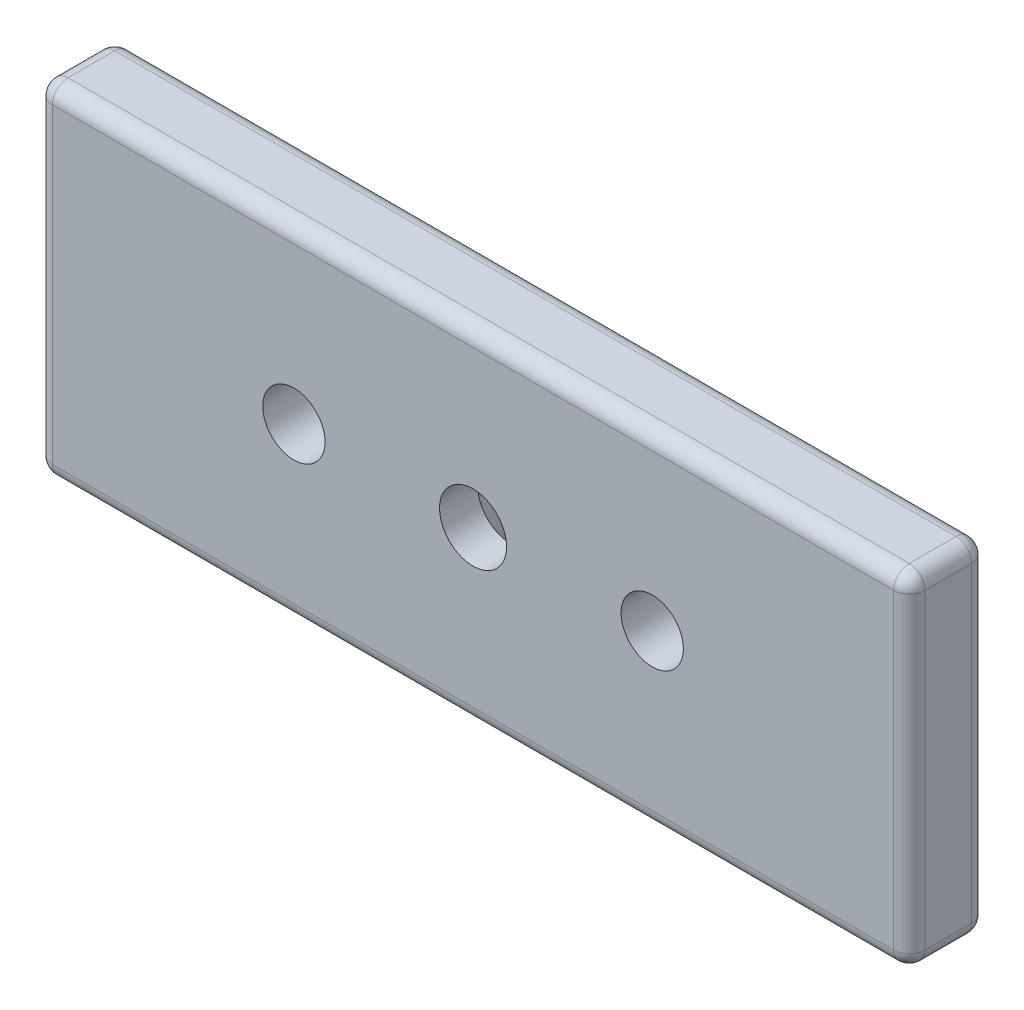
ISO-10303-21;
HEADER;
FILE_DESCRIPTION(('STEP AP214'),'2;1');
FILE_NAME('part.step','',(''),(''),'','','');
FILE_SCHEMA(('AUTOMOTIVE_DESIGN { 1 0 10303 214 1 1 1 1 }'));
ENDSEC;
DATA;
#1=APPLICATION_CONTEXT('core data for automotive mechanical design processes');
#2=APPLICATION_PROTOCOL_DEFINITION('international standard','automotive_design',2000,#1);
#3=PRODUCT_CONTEXT('',#1,'mechanical');
#4=PRODUCT('Part','Part','',(#3));
#5=PRODUCT_RELATED_PRODUCT_CATEGORY('part','',(#4));
#6=PRODUCT_DEFINITION_FORMATION('','',#4);
#7=PRODUCT_DEFINITION_CONTEXT('part definition',#1,'design');
#8=PRODUCT_DEFINITION('design','',#6,#7);
#9=PRODUCT_DEFINITION_SHAPE('','',#8);
#10=(LENGTH_UNIT() NAMED_UNIT(*) SI_UNIT(.MILLI.,.METRE.));
#11=(NAMED_UNIT(*) PLANE_ANGLE_UNIT() SI_UNIT($,.RADIAN.));
#12=(NAMED_UNIT(*) SI_UNIT($,.STERADIAN.) SOLID_ANGLE_UNIT());
#13=UNCERTAINTY_MEASURE_WITH_UNIT(LENGTH_MEASURE(1.E-05),#10,'distance_accuracy_value','');
#14=(GEOMETRIC_REPRESENTATION_CONTEXT(3) GLOBAL_UNCERTAINTY_ASSIGNED_CONTEXT((#13)) GLOBAL_UNIT_ASSIGNED_CONTEXT((#10,
#11,#12)) REPRESENTATION_CONTEXT('',''));
#15=CARTESIAN_POINT('',(0.,0.,0.));
#16=DIRECTION('',(0.,0.,1.));
#17=DIRECTION('',(1.,0.,0.));
#18=AXIS2_PLACEMENT_3D('',#15,#16,#17);
#19=CARTESIAN_POINT('',(0.,0.,5.));
#20=DIRECTION('',(1.,0.,0.));
#21=DIRECTION('',(0.,0.,-1.));
#22=AXIS2_PLACEMENT_3D('',#19,#20,#21);
#23=PLANE('',#22);
#24=DIRECTION('',(0.,0.,-1.));
#25=VECTOR('',#24,1.);
#26=CARTESIAN_POINT('',(0.,21.,5.));
#27=LINE('',#26,#25);
#28=CARTESIAN_POINT('',(0.,21.,4.));
#29=VERTEX_POINT('',#28);
#30=CARTESIAN_POINT('',(0.,21.,1.));
#31=VERTEX_POINT('',#30);
#32=EDGE_CURVE('E324',#29,#31,#27,.T.);
#33=ORIENTED_EDGE('',*,*,#32,.T.);
#34=DIRECTION('',(0.,-1.,0.));
#35=VECTOR('',#34,1.);
#36=CARTESIAN_POINT('',(0.,1.,1.));
#37=LINE('',#36,#35);
#38=CARTESIAN_POINT('',(0.,1.,1.));
#39=VERTEX_POINT('',#38);
#40=EDGE_CURVE('E312',#31,#39,#37,.T.);
#41=ORIENTED_EDGE('',*,*,#40,.T.);
#42=DIRECTION('',(0.,0.,-1.));
#43=VECTOR('',#42,1.);
#44=CARTESIAN_POINT('',(0.,1.,5.));
#45=LINE('',#44,#43);
#46=CARTESIAN_POINT('',(0.,1.,4.));
#47=VERTEX_POINT('',#46);
#48=EDGE_CURVE('E269',#39,#47,#45,.F.);
#49=ORIENTED_EDGE('',*,*,#48,.T.);
#50=DIRECTION('',(0.,-1.,0.));
#51=VECTOR('',#50,1.);
#52=CARTESIAN_POINT('',(0.,0.,4.));
#53=LINE('',#52,#51);
#54=EDGE_CURVE('E234',#47,#29,#53,.F.);
#55=ORIENTED_EDGE('',*,*,#54,.T.);
#56=EDGE_LOOP('',(#33,#41,#49,#55));
#57=FACE_BOUND('',#56,.T.);
#58=ADVANCED_FACE('F41',(#57),#23,.F.);
#59=CARTESIAN_POINT('',(0.,0.,5.));
#60=DIRECTION('',(0.,1.,0.));
#61=DIRECTION('',(0.,0.,1.));
#62=AXIS2_PLACEMENT_3D('',#59,#60,#61);
#63=PLANE('',#62);
#64=DIRECTION('',(0.,0.,-1.));
#65=VECTOR('',#64,1.);
#66=CARTESIAN_POINT('',(1.,0.,5.));
#67=LINE('',#66,#65);
#68=CARTESIAN_POINT('',(1.,0.,4.));
#69=VERTEX_POINT('',#68);
#70=CARTESIAN_POINT('',(1.,0.,1.));
#71=VERTEX_POINT('',#70);
#72=EDGE_CURVE('E157',#69,#71,#67,.T.);
#73=ORIENTED_EDGE('',*,*,#72,.T.);
#74=DIRECTION('',(1.,0.,0.));
#75=VECTOR('',#74,1.);
#76=CARTESIAN_POINT('',(55.,0.,1.));
#77=LINE('',#76,#75);
#78=CARTESIAN_POINT('',(55.,0.,1.));
#79=VERTEX_POINT('',#78);
#80=EDGE_CURVE('E302',#71,#79,#77,.T.);
#81=ORIENTED_EDGE('',*,*,#80,.T.);
#82=DIRECTION('',(0.,0.,-1.));
#83=VECTOR('',#82,1.);
#84=CARTESIAN_POINT('',(55.,0.,5.));
#85=LINE('',#84,#83);
#86=CARTESIAN_POINT('',(55.,0.,4.));
#87=VERTEX_POINT('',#86);
#88=EDGE_CURVE('E332',#79,#87,#85,.F.);
#89=ORIENTED_EDGE('',*,*,#88,.T.);
#90=DIRECTION('',(1.,0.,0.));
#91=VECTOR('',#90,1.);
#92=CARTESIAN_POINT('',(0.,0.,4.));
#93=LINE('',#92,#91);
#94=EDGE_CURVE('E299',#87,#69,#93,.F.);
#95=ORIENTED_EDGE('',*,*,#94,.T.);
#96=EDGE_LOOP('',(#73,#81,#89,#95));
#97=FACE_BOUND('',#96,.T.);
#98=ADVANCED_FACE('F360',(#97),#63,.F.);
#99=CARTESIAN_POINT('',(56.,0.,5.));
#100=DIRECTION('',(-1.,0.,0.));
#101=DIRECTION('',(0.,0.,1.));
#102=AXIS2_PLACEMENT_3D('',#99,#100,#101);
#103=PLANE('',#102);
#104=DIRECTION('',(0.,0.,-1.));
#105=VECTOR('',#104,1.);
#106=CARTESIAN_POINT('',(56.,1.,5.));
#107=LINE('',#106,#105);
#108=CARTESIAN_POINT('',(56.,1.,4.));
#109=VERTEX_POINT('',#108);
#110=CARTESIAN_POINT('',(56.,1.,1.));
#111=VERTEX_POINT('',#110);
#112=EDGE_CURVE('E138',#109,#111,#107,.T.);
#113=ORIENTED_EDGE('',*,*,#112,.T.);
#114=DIRECTION('',(0.,1.,0.));
#115=VECTOR('',#114,1.);
#116=CARTESIAN_POINT('',(56.,21.,1.));
#117=LINE('',#116,#115);
#118=CARTESIAN_POINT('',(56.,21.,1.));
#119=VERTEX_POINT('',#118);
#120=EDGE_CURVE('E133',#111,#119,#117,.T.);
#121=ORIENTED_EDGE('',*,*,#120,.T.);
#122=DIRECTION('',(0.,0.,-1.));
#123=VECTOR('',#122,1.);
#124=CARTESIAN_POINT('',(56.,21.,5.));
#125=LINE('',#124,#123);
#126=CARTESIAN_POINT('',(56.,21.,4.));
#127=VERTEX_POINT('',#126);
#128=EDGE_CURVE('E136',#119,#127,#125,.F.);
#129=ORIENTED_EDGE('',*,*,#128,.T.);
#130=DIRECTION('',(0.,1.,0.));
#131=VECTOR('',#130,1.);
#132=CARTESIAN_POINT('',(56.,0.,4.));
#133=LINE('',#132,#131);
#134=EDGE_CURVE('E144',#127,#109,#133,.F.);
#135=ORIENTED_EDGE('',*,*,#134,.T.);
#136=EDGE_LOOP('',(#113,#121,#129,#135));
#137=FACE_BOUND('',#136,.T.);
#138=ADVANCED_FACE('F135',(#137),#103,.F.);
#139=CARTESIAN_POINT('',(0.,22.,5.));
#140=DIRECTION('',(0.,-1.,0.));
#141=DIRECTION('',(0.,0.,-1.));
#142=AXIS2_PLACEMENT_3D('',#139,#140,#141);
#143=PLANE('',#142);
#144=DIRECTION('',(0.,0.,-1.));
#145=VECTOR('',#144,1.);
#146=CARTESIAN_POINT('',(55.,22.,5.));
#147=LINE('',#146,#145);
#148=CARTESIAN_POINT('',(55.,22.,4.));
#149=VERTEX_POINT('',#148);
#150=CARTESIAN_POINT('',(55.,22.,1.));
#151=VERTEX_POINT('',#150);
#152=EDGE_CURVE('E256',#149,#151,#147,.T.);
#153=ORIENTED_EDGE('',*,*,#152,.T.);
#154=DIRECTION('',(-1.,0.,0.));
#155=VECTOR('',#154,1.);
#156=CARTESIAN_POINT('',(1.,22.,1.));
#157=LINE('',#156,#155);
#158=CARTESIAN_POINT('',(1.,22.,1.));
#159=VERTEX_POINT('',#158);
#160=EDGE_CURVE('E11',#151,#159,#157,.T.);
#161=ORIENTED_EDGE('',*,*,#160,.T.);
#162=DIRECTION('',(0.,0.,-1.));
#163=VECTOR('',#162,1.);
#164=CARTESIAN_POINT('',(1.,22.,5.));
#165=LINE('',#164,#163);
#166=CARTESIAN_POINT('',(1.,22.,4.));
#167=VERTEX_POINT('',#166);
#168=EDGE_CURVE('E258',#159,#167,#165,.F.);
#169=ORIENTED_EDGE('',*,*,#168,.T.);
#170=DIRECTION('',(-1.,0.,0.));
#171=VECTOR('',#170,1.);
#172=CARTESIAN_POINT('',(0.,22.,4.));
#173=LINE('',#172,#171);
#174=EDGE_CURVE('E51',#167,#149,#173,.F.);
#175=ORIENTED_EDGE('',*,*,#174,.T.);
#176=EDGE_LOOP('',(#153,#161,#169,#175));
#177=FACE_BOUND('',#176,.T.);
#178=ADVANCED_FACE('F255',(#177),#143,.F.);
#179=CARTESIAN_POINT('',(0.,0.,5.));
#180=DIRECTION('',(0.,0.,-1.));
#181=DIRECTION('',(-1.,0.,0.));
#182=AXIS2_PLACEMENT_3D('',#179,#180,#181);
#183=PLANE('',#182);
#184=CARTESIAN_POINT('',(28.,11.,5.));
#185=DIRECTION('',(0.,0.,-1.));
#186=DIRECTION('',(-1.,0.,0.));
#187=AXIS2_PLACEMENT_3D('',#184,#185,#186);
#188=CIRCLE('',#187,2.14999999999999);
#189=CARTESIAN_POINT('',(25.85,11.,5.));
#190=VERTEX_POINT('',#189);
#191=EDGE_CURVE('E209',#190,#190,#188,.T.);
#192=ORIENTED_EDGE('',*,*,#191,.T.);
#193=EDGE_LOOP('',(#192));
#194=FACE_BOUND('',#193,.T.);
#195=DIRECTION('',(1.,0.,0.));
#196=VECTOR('',#195,1.);
#197=CARTESIAN_POINT('',(0.,1.,5.));
#198=LINE('',#197,#196);
#199=CARTESIAN_POINT('',(1.,1.,5.));
#200=VERTEX_POINT('',#199);
#201=CARTESIAN_POINT('',(55.,1.,5.));
#202=VERTEX_POINT('',#201);
#203=EDGE_CURVE('E59',#200,#202,#198,.T.);
#204=ORIENTED_EDGE('',*,*,#203,.T.);
#205=DIRECTION('',(0.,1.,0.));
#206=VECTOR('',#205,1.);
#207=CARTESIAN_POINT('',(55.,0.,5.));
#208=LINE('',#207,#206);
#209=CARTESIAN_POINT('',(55.,21.,5.));
#210=VERTEX_POINT('',#209);
#211=EDGE_CURVE('E243',#202,#210,#208,.T.);
#212=ORIENTED_EDGE('',*,*,#211,.T.);
#213=DIRECTION('',(-1.,0.,0.));
#214=VECTOR('',#213,1.);
#215=CARTESIAN_POINT('',(0.,21.,5.));
#216=LINE('',#215,#214);
#217=CARTESIAN_POINT('',(1.,21.,5.));
#218=VERTEX_POINT('',#217);
#219=EDGE_CURVE('E248',#210,#218,#216,.T.);
#220=ORIENTED_EDGE('',*,*,#219,.T.);
#221=DIRECTION('',(0.,-1.,0.));
#222=VECTOR('',#221,1.);
#223=CARTESIAN_POINT('',(1.,0.,5.));
#224=LINE('',#223,#222);
#225=EDGE_CURVE('E64',#218,#200,#224,.T.);
#226=ORIENTED_EDGE('',*,*,#225,.T.);
#227=EDGE_LOOP('',(#204,#212,#220,#226));
#228=FACE_BOUND('',#227,.T.);
#229=CARTESIAN_POINT('',(16.5,11.,5.));
#230=DIRECTION('',(0.,0.,1.));
#231=DIRECTION('',(1.,0.,0.));
#232=AXIS2_PLACEMENT_3D('',#229,#230,#231);
#233=CIRCLE('',#232,2.);
#234=CARTESIAN_POINT('',(18.5,11.,5.));
#235=VERTEX_POINT('',#234);
#236=EDGE_CURVE('E382',#235,#235,#233,.T.);
#237=ORIENTED_EDGE('',*,*,#236,.F.);
#238=EDGE_LOOP('',(#237));
#239=FACE_BOUND('',#238,.T.);
#240=CARTESIAN_POINT('',(39.5,11.,5.));
#241=DIRECTION('',(0.,0.,1.));
#242=DIRECTION('',(1.,0.,0.));
#243=AXIS2_PLACEMENT_3D('',#240,#241,#242);
#244=CIRCLE('',#243,2.);
#245=CARTESIAN_POINT('',(41.5,11.,5.));
#246=VERTEX_POINT('',#245);
#247=EDGE_CURVE('E204',#246,#246,#244,.T.);
#248=ORIENTED_EDGE('',*,*,#247,.F.);
#249=EDGE_LOOP('',(#248));
#250=FACE_BOUND('',#249,.T.);
#251=ADVANCED_FACE('F276',(#194,#228,#239,#250),#183,.F.);
#252=CARTESIAN_POINT('',(0.,0.,0.));
#253=DIRECTION('',(0.,0.,-1.));
#254=DIRECTION('',(-1.,0.,0.));
#255=AXIS2_PLACEMENT_3D('',#252,#253,#254);
#256=PLANE('',#255);
#257=CARTESIAN_POINT('',(28.,11.,0.));
#258=DIRECTION('',(0.,0.,-1.));
#259=DIRECTION('',(-1.,0.,0.));
#260=AXIS2_PLACEMENT_3D('',#257,#258,#259);
#261=CIRCLE('',#260,4.7);
#262=CARTESIAN_POINT('',(23.3,11.,0.));
#263=VERTEX_POINT('',#262);
#264=EDGE_CURVE('E396',#263,#263,#261,.T.);
#265=ORIENTED_EDGE('',*,*,#264,.F.);
#266=EDGE_LOOP('',(#265));
#267=FACE_BOUND('',#266,.T.);
#268=DIRECTION('',(-1.,0.,0.));
#269=VECTOR('',#268,1.);
#270=CARTESIAN_POINT('',(55.,21.,0.));
#271=LINE('',#270,#269);
#272=CARTESIAN_POINT('',(1.,21.,0.));
#273=VERTEX_POINT('',#272);
#274=CARTESIAN_POINT('',(55.,21.,0.));
#275=VERTEX_POINT('',#274);
#276=EDGE_CURVE('E143',#273,#275,#271,.F.);
#277=ORIENTED_EDGE('',*,*,#276,.T.);
#278=DIRECTION('',(0.,1.,0.));
#279=VECTOR('',#278,1.);
#280=CARTESIAN_POINT('',(55.,1.,0.));
#281=LINE('',#280,#279);
#282=CARTESIAN_POINT('',(55.,1.,0.));
#283=VERTEX_POINT('',#282);
#284=EDGE_CURVE('E171',#275,#283,#281,.F.);
#285=ORIENTED_EDGE('',*,*,#284,.T.);
#286=DIRECTION('',(1.,0.,0.));
#287=VECTOR('',#286,1.);
#288=CARTESIAN_POINT('',(1.,1.,0.));
#289=LINE('',#288,#287);
#290=CARTESIAN_POINT('',(1.,1.,0.));
#291=VERTEX_POINT('',#290);
#292=EDGE_CURVE('E288',#283,#291,#289,.F.);
#293=ORIENTED_EDGE('',*,*,#292,.T.);
#294=DIRECTION('',(0.,-1.,0.));
#295=VECTOR('',#294,1.);
#296=CARTESIAN_POINT('',(1.,21.,0.));
#297=LINE('',#296,#295);
#298=EDGE_CURVE('E285',#291,#273,#297,.F.);
#299=ORIENTED_EDGE('',*,*,#298,.T.);
#300=EDGE_LOOP('',(#277,#285,#293,#299));
#301=FACE_BOUND('',#300,.T.);
#302=CARTESIAN_POINT('',(16.5,11.,0.));
#303=DIRECTION('',(0.,0.,1.));
#304=DIRECTION('',(1.,0.,0.));
#305=AXIS2_PLACEMENT_3D('',#302,#303,#304);
#306=CIRCLE('',#305,2.);
#307=CARTESIAN_POINT('',(18.5,11.,0.));
#308=VERTEX_POINT('',#307);
#309=EDGE_CURVE('E374',#308,#308,#306,.T.);
#310=ORIENTED_EDGE('',*,*,#309,.T.);
#311=EDGE_LOOP('',(#310));
#312=FACE_BOUND('',#311,.T.);
#313=CARTESIAN_POINT('',(39.5,11.,0.));
#314=DIRECTION('',(0.,0.,1.));
#315=DIRECTION('',(1.,0.,0.));
#316=AXIS2_PLACEMENT_3D('',#313,#314,#315);
#317=CIRCLE('',#316,2.);
#318=CARTESIAN_POINT('',(41.5,11.,0.));
#319=VERTEX_POINT('',#318);
#320=EDGE_CURVE('E378',#319,#319,#317,.T.);
#321=ORIENTED_EDGE('',*,*,#320,.T.);
#322=EDGE_LOOP('',(#321));
#323=FACE_BOUND('',#322,.T.);
#324=ADVANCED_FACE('F344',(#267,#301,#312,#323),#256,.T.);
#325=CARTESIAN_POINT('',(39.5,11.,0.));
#326=DIRECTION('',(0.,0.,1.));
#327=DIRECTION('',(1.,0.,0.));
#328=AXIS2_PLACEMENT_3D('',#325,#326,#327);
#329=CYLINDRICAL_SURFACE('',#328,2.);
#330=ORIENTED_EDGE('',*,*,#320,.F.);
#331=EDGE_LOOP('',(#330));
#332=FACE_BOUND('',#331,.T.);
#333=ORIENTED_EDGE('',*,*,#247,.T.);
#334=EDGE_LOOP('',(#333));
#335=FACE_BOUND('',#334,.T.);
#336=ADVANCED_FACE('F404',(#332,#335),#329,.F.);
#337=CARTESIAN_POINT('',(16.5,11.,0.));
#338=DIRECTION('',(0.,0.,1.));
#339=DIRECTION('',(1.,0.,0.));
#340=AXIS2_PLACEMENT_3D('',#337,#338,#339);
#341=CYLINDRICAL_SURFACE('',#340,2.);
#342=ORIENTED_EDGE('',*,*,#309,.F.);
#343=EDGE_LOOP('',(#342));
#344=FACE_BOUND('',#343,.T.);
#345=ORIENTED_EDGE('',*,*,#236,.T.);
#346=EDGE_LOOP('',(#345));
#347=FACE_BOUND('',#346,.T.);
#348=ADVANCED_FACE('F410',(#344,#347),#341,.F.);
#349=CARTESIAN_POINT('',(55.,21.,5.));
#350=DIRECTION('',(0.,0.,-1.));
#351=DIRECTION('',(-1.,0.,0.));
#352=AXIS2_PLACEMENT_3D('',#349,#350,#351);
#353=CYLINDRICAL_SURFACE('',#352,1.);
#354=ORIENTED_EDGE('',*,*,#128,.F.);
#355=CARTESIAN_POINT('',(55.,21.,1.));
#356=DIRECTION('',(0.,0.,-1.));
#357=DIRECTION('',(-1.,0.,0.));
#358=AXIS2_PLACEMENT_3D('',#355,#356,#357);
#359=CIRCLE('',#358,1.);
#360=EDGE_CURVE('E152',#119,#151,#359,.F.);
#361=ORIENTED_EDGE('',*,*,#360,.T.);
#362=ORIENTED_EDGE('',*,*,#152,.F.);
#363=CARTESIAN_POINT('',(55.,21.,4.));
#364=DIRECTION('',(0.,0.,-1.));
#365=DIRECTION('',(-1.,0.,0.));
#366=AXIS2_PLACEMENT_3D('',#363,#364,#365);
#367=CIRCLE('',#366,1.);
#368=EDGE_CURVE('E155',#149,#127,#367,.T.);
#369=ORIENTED_EDGE('',*,*,#368,.T.);
#370=EDGE_LOOP('',(#354,#361,#362,#369));
#371=FACE_BOUND('',#370,.T.);
#372=ADVANCED_FACE('F150',(#371),#353,.T.);
#373=CARTESIAN_POINT('',(55.,1.,5.));
#374=DIRECTION('',(0.,0.,-1.));
#375=DIRECTION('',(-1.,0.,0.));
#376=AXIS2_PLACEMENT_3D('',#373,#374,#375);
#377=CYLINDRICAL_SURFACE('',#376,1.);
#378=ORIENTED_EDGE('',*,*,#88,.F.);
#379=CARTESIAN_POINT('',(55.,1.,1.));
#380=DIRECTION('',(0.,0.,-1.));
#381=DIRECTION('',(-1.,0.,0.));
#382=AXIS2_PLACEMENT_3D('',#379,#380,#381);
#383=CIRCLE('',#382,1.);
#384=EDGE_CURVE('E296',#79,#111,#383,.F.);
#385=ORIENTED_EDGE('',*,*,#384,.T.);
#386=ORIENTED_EDGE('',*,*,#112,.F.);
#387=CARTESIAN_POINT('',(55.,1.,4.));
#388=DIRECTION('',(0.,0.,-1.));
#389=DIRECTION('',(-1.,0.,0.));
#390=AXIS2_PLACEMENT_3D('',#387,#388,#389);
#391=CIRCLE('',#390,1.);
#392=EDGE_CURVE('E293',#109,#87,#391,.T.);
#393=ORIENTED_EDGE('',*,*,#392,.T.);
#394=EDGE_LOOP('',(#378,#385,#386,#393));
#395=FACE_BOUND('',#394,.T.);
#396=ADVANCED_FACE('F426',(#395),#377,.T.);
#397=CARTESIAN_POINT('',(1.,1.,5.));
#398=DIRECTION('',(0.,0.,-1.));
#399=DIRECTION('',(-1.,0.,0.));
#400=AXIS2_PLACEMENT_3D('',#397,#398,#399);
#401=CYLINDRICAL_SURFACE('',#400,1.);
#402=ORIENTED_EDGE('',*,*,#48,.F.);
#403=CARTESIAN_POINT('',(1.,1.,1.));
#404=DIRECTION('',(0.,0.,-1.));
#405=DIRECTION('',(-1.,0.,0.));
#406=AXIS2_PLACEMENT_3D('',#403,#404,#405);
#407=CIRCLE('',#406,1.);
#408=EDGE_CURVE('E307',#39,#71,#407,.F.);
#409=ORIENTED_EDGE('',*,*,#408,.T.);
#410=ORIENTED_EDGE('',*,*,#72,.F.);
#411=CARTESIAN_POINT('',(1.,1.,4.));
#412=DIRECTION('',(0.,0.,-1.));
#413=DIRECTION('',(-1.,0.,0.));
#414=AXIS2_PLACEMENT_3D('',#411,#412,#413);
#415=CIRCLE('',#414,1.);
#416=EDGE_CURVE('E237',#69,#47,#415,.T.);
#417=ORIENTED_EDGE('',*,*,#416,.T.);
#418=EDGE_LOOP('',(#402,#409,#410,#417));
#419=FACE_BOUND('',#418,.T.);
#420=ADVANCED_FACE('F358',(#419),#401,.T.);
#421=CARTESIAN_POINT('',(1.,21.,5.));
#422=DIRECTION('',(0.,0.,-1.));
#423=DIRECTION('',(-1.,0.,0.));
#424=AXIS2_PLACEMENT_3D('',#421,#422,#423);
#425=CYLINDRICAL_SURFACE('',#424,1.);
#426=ORIENTED_EDGE('',*,*,#168,.F.);
#427=CARTESIAN_POINT('',(1.,21.,1.));
#428=DIRECTION('',(0.,0.,-1.));
#429=DIRECTION('',(-1.,0.,0.));
#430=AXIS2_PLACEMENT_3D('',#427,#428,#429);
#431=CIRCLE('',#430,1.);
#432=EDGE_CURVE('E274',#159,#31,#431,.F.);
#433=ORIENTED_EDGE('',*,*,#432,.T.);
#434=ORIENTED_EDGE('',*,*,#32,.F.);
#435=CARTESIAN_POINT('',(1.,21.,4.));
#436=DIRECTION('',(0.,0.,-1.));
#437=DIRECTION('',(-1.,0.,0.));
#438=AXIS2_PLACEMENT_3D('',#435,#436,#437);
#439=CIRCLE('',#438,1.);
#440=EDGE_CURVE('E315',#29,#167,#439,.T.);
#441=ORIENTED_EDGE('',*,*,#440,.T.);
#442=EDGE_LOOP('',(#426,#433,#434,#441));
#443=FACE_BOUND('',#442,.T.);
#444=ADVANCED_FACE('F323',(#443),#425,.T.);
#445=CARTESIAN_POINT('',(1.,1.,1.));
#446=DIRECTION('',(0.,0.,-1.));
#447=DIRECTION('',(-1.,0.,0.));
#448=AXIS2_PLACEMENT_3D('',#445,#446,#447);
#449=SPHERICAL_SURFACE('',#448,1.);
#450=CARTESIAN_POINT('',(1.,1.,1.));
#451=DIRECTION('',(1.,0.,0.));
#452=DIRECTION('',(0.,0.,-1.));
#453=AXIS2_PLACEMENT_3D('',#450,#451,#452);
#454=CIRCLE('',#453,1.);
#455=EDGE_CURVE('E196',#71,#291,#454,.T.);
#456=ORIENTED_EDGE('',*,*,#455,.F.);
#457=ORIENTED_EDGE('',*,*,#408,.F.);
#458=CARTESIAN_POINT('',(1.,1.,1.));
#459=DIRECTION('',(0.,1.,0.));
#460=DIRECTION('',(0.,0.,1.));
#461=AXIS2_PLACEMENT_3D('',#458,#459,#460);
#462=CIRCLE('',#461,1.);
#463=EDGE_CURVE('E200',#291,#39,#462,.T.);
#464=ORIENTED_EDGE('',*,*,#463,.F.);
#465=EDGE_LOOP('',(#456,#457,#464));
#466=FACE_BOUND('',#465,.T.);
#467=ADVANCED_FACE('F354',(#466),#449,.T.);
#468=CARTESIAN_POINT('',(1.,0.,1.));
#469=DIRECTION('',(0.,1.,0.));
#470=DIRECTION('',(0.,0.,1.));
#471=AXIS2_PLACEMENT_3D('',#468,#469,#470);
#472=CYLINDRICAL_SURFACE('',#471,1.);
#473=ORIENTED_EDGE('',*,*,#463,.T.);
#474=ORIENTED_EDGE('',*,*,#40,.F.);
#475=CARTESIAN_POINT('',(1.,21.,1.));
#476=DIRECTION('',(0.,1.,0.));
#477=DIRECTION('',(0.,0.,1.));
#478=AXIS2_PLACEMENT_3D('',#475,#476,#477);
#479=CIRCLE('',#478,1.);
#480=EDGE_CURVE('E192',#273,#31,#479,.T.);
#481=ORIENTED_EDGE('',*,*,#480,.F.);
#482=ORIENTED_EDGE('',*,*,#298,.F.);
#483=EDGE_LOOP('',(#473,#474,#481,#482));
#484=FACE_BOUND('',#483,.T.);
#485=ADVANCED_FACE('F336',(#484),#472,.T.);
#486=CARTESIAN_POINT('',(0.,1.,1.));
#487=DIRECTION('',(-1.,0.,0.));
#488=DIRECTION('',(0.,0.,1.));
#489=AXIS2_PLACEMENT_3D('',#486,#487,#488);
#490=CYLINDRICAL_SURFACE('',#489,1.);
#491=ORIENTED_EDGE('',*,*,#455,.T.);
#492=ORIENTED_EDGE('',*,*,#292,.F.);
#493=CARTESIAN_POINT('',(55.,1.,1.));
#494=DIRECTION('',(1.,0.,0.));
#495=DIRECTION('',(0.,0.,-1.));
#496=AXIS2_PLACEMENT_3D('',#493,#494,#495);
#497=CIRCLE('',#496,1.);
#498=EDGE_CURVE('E188',#79,#283,#497,.T.);
#499=ORIENTED_EDGE('',*,*,#498,.F.);
#500=ORIENTED_EDGE('',*,*,#80,.F.);
#501=EDGE_LOOP('',(#491,#492,#499,#500));
#502=FACE_BOUND('',#501,.T.);
#503=ADVANCED_FACE('F351',(#502),#490,.T.);
#504=CARTESIAN_POINT('',(1.,21.,1.));
#505=DIRECTION('',(0.,0.,-1.));
#506=DIRECTION('',(-1.,0.,0.));
#507=AXIS2_PLACEMENT_3D('',#504,#505,#506);
#508=SPHERICAL_SURFACE('',#507,1.);
#509=ORIENTED_EDGE('',*,*,#480,.T.);
#510=ORIENTED_EDGE('',*,*,#432,.F.);
#511=CARTESIAN_POINT('',(1.,21.,1.));
#512=DIRECTION('',(1.,0.,0.));
#513=DIRECTION('',(0.,0.,-1.));
#514=AXIS2_PLACEMENT_3D('',#511,#512,#513);
#515=CIRCLE('',#514,1.);
#516=EDGE_CURVE('E184',#273,#159,#515,.T.);
#517=ORIENTED_EDGE('',*,*,#516,.F.);
#518=EDGE_LOOP('',(#509,#510,#517));
#519=FACE_BOUND('',#518,.T.);
#520=ADVANCED_FACE('F339',(#519),#508,.T.);
#521=CARTESIAN_POINT('',(55.,1.,1.));
#522=DIRECTION('',(0.,0.,-1.));
#523=DIRECTION('',(-1.,0.,0.));
#524=AXIS2_PLACEMENT_3D('',#521,#522,#523);
#525=SPHERICAL_SURFACE('',#524,1.);
#526=ORIENTED_EDGE('',*,*,#384,.F.);
#527=ORIENTED_EDGE('',*,*,#498,.T.);
#528=CARTESIAN_POINT('',(55.,1.,1.));
#529=DIRECTION('',(0.,1.,0.));
#530=DIRECTION('',(0.,0.,1.));
#531=AXIS2_PLACEMENT_3D('',#528,#529,#530);
#532=CIRCLE('',#531,1.);
#533=EDGE_CURVE('E176',#111,#283,#532,.T.);
#534=ORIENTED_EDGE('',*,*,#533,.F.);
#535=EDGE_LOOP('',(#526,#527,#534));
#536=FACE_BOUND('',#535,.T.);
#537=ADVANCED_FACE('F440',(#536),#525,.T.);
#538=CARTESIAN_POINT('',(0.,21.,1.));
#539=DIRECTION('',(1.,0.,0.));
#540=DIRECTION('',(0.,0.,-1.));
#541=AXIS2_PLACEMENT_3D('',#538,#539,#540);
#542=CYLINDRICAL_SURFACE('',#541,1.);
#543=ORIENTED_EDGE('',*,*,#516,.T.);
#544=ORIENTED_EDGE('',*,*,#160,.F.);
#545=CARTESIAN_POINT('',(55.,21.,1.));
#546=DIRECTION('',(1.,0.,0.));
#547=DIRECTION('',(0.,0.,-1.));
#548=AXIS2_PLACEMENT_3D('',#545,#546,#547);
#549=CIRCLE('',#548,1.);
#550=EDGE_CURVE('E164',#275,#151,#549,.T.);
#551=ORIENTED_EDGE('',*,*,#550,.F.);
#552=ORIENTED_EDGE('',*,*,#276,.F.);
#553=EDGE_LOOP('',(#543,#544,#551,#552));
#554=FACE_BOUND('',#553,.T.);
#555=ADVANCED_FACE('F342',(#554),#542,.T.);
#556=CARTESIAN_POINT('',(55.,0.,1.));
#557=DIRECTION('',(0.,-1.,0.));
#558=DIRECTION('',(0.,0.,-1.));
#559=AXIS2_PLACEMENT_3D('',#556,#557,#558);
#560=CYLINDRICAL_SURFACE('',#559,1.);
#561=ORIENTED_EDGE('',*,*,#533,.T.);
#562=ORIENTED_EDGE('',*,*,#284,.F.);
#563=CARTESIAN_POINT('',(55.,21.,1.));
#564=DIRECTION('',(0.,1.,0.));
#565=DIRECTION('',(0.,0.,1.));
#566=AXIS2_PLACEMENT_3D('',#563,#564,#565);
#567=CIRCLE('',#566,1.);
#568=EDGE_CURVE('E162',#119,#275,#567,.T.);
#569=ORIENTED_EDGE('',*,*,#568,.F.);
#570=ORIENTED_EDGE('',*,*,#120,.F.);
#571=EDGE_LOOP('',(#561,#562,#569,#570));
#572=FACE_BOUND('',#571,.T.);
#573=ADVANCED_FACE('F169',(#572),#560,.T.);
#574=CARTESIAN_POINT('',(55.,21.,1.));
#575=DIRECTION('',(0.,0.,-1.));
#576=DIRECTION('',(-1.,0.,0.));
#577=AXIS2_PLACEMENT_3D('',#574,#575,#576);
#578=SPHERICAL_SURFACE('',#577,1.);
#579=ORIENTED_EDGE('',*,*,#550,.T.);
#580=ORIENTED_EDGE('',*,*,#360,.F.);
#581=ORIENTED_EDGE('',*,*,#568,.T.);
#582=EDGE_LOOP('',(#579,#580,#581));
#583=FACE_BOUND('',#582,.T.);
#584=ADVANCED_FACE('F161',(#583),#578,.T.);
#585=CARTESIAN_POINT('',(1.,1.,4.));
#586=DIRECTION('',(0.,0.,-1.));
#587=DIRECTION('',(-1.,0.,0.));
#588=AXIS2_PLACEMENT_3D('',#585,#586,#587);
#589=SPHERICAL_SURFACE('',#588,1.);
#590=CARTESIAN_POINT('',(1.,1.,4.));
#591=DIRECTION('',(0.,1.,0.));
#592=DIRECTION('',(0.,0.,1.));
#593=AXIS2_PLACEMENT_3D('',#590,#591,#592);
#594=CIRCLE('',#593,1.);
#595=EDGE_CURVE('E179',#47,#200,#594,.T.);
#596=ORIENTED_EDGE('',*,*,#595,.F.);
#597=ORIENTED_EDGE('',*,*,#416,.F.);
#598=CARTESIAN_POINT('',(1.,1.,4.));
#599=DIRECTION('',(1.,0.,0.));
#600=DIRECTION('',(0.,0.,-1.));
#601=AXIS2_PLACEMENT_3D('',#598,#599,#600);
#602=CIRCLE('',#601,1.);
#603=EDGE_CURVE('E45',#200,#69,#602,.T.);
#604=ORIENTED_EDGE('',*,*,#603,.F.);
#605=EDGE_LOOP('',(#596,#597,#604));
#606=FACE_BOUND('',#605,.T.);
#607=ADVANCED_FACE('F43',(#606),#589,.T.);
#608=CARTESIAN_POINT('',(0.,1.,4.));
#609=DIRECTION('',(1.,0.,0.));
#610=DIRECTION('',(0.,0.,-1.));
#611=AXIS2_PLACEMENT_3D('',#608,#609,#610);
#612=CYLINDRICAL_SURFACE('',#611,1.);
#613=ORIENTED_EDGE('',*,*,#603,.T.);
#614=ORIENTED_EDGE('',*,*,#94,.F.);
#615=CARTESIAN_POINT('',(55.,1.,4.));
#616=DIRECTION('',(1.,0.,0.));
#617=DIRECTION('',(0.,0.,-1.));
#618=AXIS2_PLACEMENT_3D('',#615,#616,#617);
#619=CIRCLE('',#618,1.);
#620=EDGE_CURVE('E224',#202,#87,#619,.T.);
#621=ORIENTED_EDGE('',*,*,#620,.F.);
#622=ORIENTED_EDGE('',*,*,#203,.F.);
#623=EDGE_LOOP('',(#613,#614,#621,#622));
#624=FACE_BOUND('',#623,.T.);
#625=ADVANCED_FACE('F240',(#624),#612,.T.);
#626=CARTESIAN_POINT('',(1.,0.,4.));
#627=DIRECTION('',(0.,-1.,0.));
#628=DIRECTION('',(0.,0.,-1.));
#629=AXIS2_PLACEMENT_3D('',#626,#627,#628);
#630=CYLINDRICAL_SURFACE('',#629,1.);
#631=ORIENTED_EDGE('',*,*,#595,.T.);
#632=ORIENTED_EDGE('',*,*,#225,.F.);
#633=CARTESIAN_POINT('',(1.,21.,4.));
#634=DIRECTION('',(0.,1.,0.));
#635=DIRECTION('',(0.,0.,1.));
#636=AXIS2_PLACEMENT_3D('',#633,#634,#635);
#637=CIRCLE('',#636,1.);
#638=EDGE_CURVE('E220',#29,#218,#637,.T.);
#639=ORIENTED_EDGE('',*,*,#638,.F.);
#640=ORIENTED_EDGE('',*,*,#54,.F.);
#641=EDGE_LOOP('',(#631,#632,#639,#640));
#642=FACE_BOUND('',#641,.T.);
#643=ADVANCED_FACE('F232',(#642),#630,.T.);
#644=CARTESIAN_POINT('',(55.,1.,4.));
#645=DIRECTION('',(0.,0.,-1.));
#646=DIRECTION('',(-1.,0.,0.));
#647=AXIS2_PLACEMENT_3D('',#644,#645,#646);
#648=SPHERICAL_SURFACE('',#647,1.);
#649=ORIENTED_EDGE('',*,*,#620,.T.);
#650=ORIENTED_EDGE('',*,*,#392,.F.);
#651=CARTESIAN_POINT('',(55.,1.,4.));
#652=DIRECTION('',(0.,1.,0.));
#653=DIRECTION('',(0.,0.,1.));
#654=AXIS2_PLACEMENT_3D('',#651,#652,#653);
#655=CIRCLE('',#654,1.);
#656=EDGE_CURVE('E216',#202,#109,#655,.T.);
#657=ORIENTED_EDGE('',*,*,#656,.F.);
#658=EDGE_LOOP('',(#649,#650,#657));
#659=FACE_BOUND('',#658,.T.);
#660=ADVANCED_FACE('F462',(#659),#648,.T.);
#661=CARTESIAN_POINT('',(1.,21.,4.));
#662=DIRECTION('',(0.,0.,-1.));
#663=DIRECTION('',(-1.,0.,0.));
#664=AXIS2_PLACEMENT_3D('',#661,#662,#663);
#665=SPHERICAL_SURFACE('',#664,1.);
#666=ORIENTED_EDGE('',*,*,#440,.F.);
#667=ORIENTED_EDGE('',*,*,#638,.T.);
#668=CARTESIAN_POINT('',(1.,21.,4.));
#669=DIRECTION('',(1.,0.,0.));
#670=DIRECTION('',(0.,0.,-1.));
#671=AXIS2_PLACEMENT_3D('',#668,#669,#670);
#672=CIRCLE('',#671,1.);
#673=EDGE_CURVE('E212',#167,#218,#672,.T.);
#674=ORIENTED_EDGE('',*,*,#673,.F.);
#675=EDGE_LOOP('',(#666,#667,#674));
#676=FACE_BOUND('',#675,.T.);
#677=ADVANCED_FACE('F459',(#676),#665,.T.);
#678=CARTESIAN_POINT('',(55.,0.,4.));
#679=DIRECTION('',(0.,1.,0.));
#680=DIRECTION('',(0.,0.,1.));
#681=AXIS2_PLACEMENT_3D('',#678,#679,#680);
#682=CYLINDRICAL_SURFACE('',#681,1.);
#683=ORIENTED_EDGE('',*,*,#656,.T.);
#684=ORIENTED_EDGE('',*,*,#134,.F.);
#685=CARTESIAN_POINT('',(55.,21.,4.));
#686=DIRECTION('',(0.,1.,0.));
#687=DIRECTION('',(0.,0.,1.));
#688=AXIS2_PLACEMENT_3D('',#685,#686,#687);
#689=CIRCLE('',#688,1.);
#690=EDGE_CURVE('E208',#210,#127,#689,.T.);
#691=ORIENTED_EDGE('',*,*,#690,.F.);
#692=ORIENTED_EDGE('',*,*,#211,.F.);
#693=EDGE_LOOP('',(#683,#684,#691,#692));
#694=FACE_BOUND('',#693,.T.);
#695=ADVANCED_FACE('F279',(#694),#682,.T.);
#696=CARTESIAN_POINT('',(0.,21.,4.));
#697=DIRECTION('',(-1.,0.,0.));
#698=DIRECTION('',(0.,0.,1.));
#699=AXIS2_PLACEMENT_3D('',#696,#697,#698);
#700=CYLINDRICAL_SURFACE('',#699,1.);
#701=ORIENTED_EDGE('',*,*,#673,.T.);
#702=ORIENTED_EDGE('',*,*,#219,.F.);
#703=CARTESIAN_POINT('',(55.,21.,4.));
#704=DIRECTION('',(1.,0.,0.));
#705=DIRECTION('',(0.,0.,-1.));
#706=AXIS2_PLACEMENT_3D('',#703,#704,#705);
#707=CIRCLE('',#706,1.);
#708=EDGE_CURVE('E205',#149,#210,#707,.T.);
#709=ORIENTED_EDGE('',*,*,#708,.F.);
#710=ORIENTED_EDGE('',*,*,#174,.F.);
#711=EDGE_LOOP('',(#701,#702,#709,#710));
#712=FACE_BOUND('',#711,.T.);
#713=ADVANCED_FACE('F272',(#712),#700,.T.);
#714=CARTESIAN_POINT('',(55.,21.,4.));
#715=DIRECTION('',(0.,0.,-1.));
#716=DIRECTION('',(-1.,0.,0.));
#717=AXIS2_PLACEMENT_3D('',#714,#715,#716);
#718=SPHERICAL_SURFACE('',#717,1.);
#719=ORIENTED_EDGE('',*,*,#690,.T.);
#720=ORIENTED_EDGE('',*,*,#368,.F.);
#721=ORIENTED_EDGE('',*,*,#708,.T.);
#722=EDGE_LOOP('',(#719,#720,#721));
#723=FACE_BOUND('',#722,.T.);
#724=ADVANCED_FACE('F265',(#723),#718,.T.);
#725=CARTESIAN_POINT('',(28.,11.,0.));
#726=DIRECTION('',(0.,0.,-1.));
#727=DIRECTION('',(-1.,0.,0.));
#728=AXIS2_PLACEMENT_3D('',#725,#726,#727);
#729=CYLINDRICAL_SURFACE('',#728,2.14999999999999);
#730=ORIENTED_EDGE('',*,*,#191,.F.);
#731=EDGE_LOOP('',(#730));
#732=FACE_BOUND('',#731,.T.);
#733=CARTESIAN_POINT('',(28.,11.,2.55000000000001));
#734=DIRECTION('',(0.,0.,-1.));
#735=DIRECTION('',(-1.,0.,0.));
#736=AXIS2_PLACEMENT_3D('',#733,#734,#735);
#737=CIRCLE('',#736,2.14999999999999);
#738=CARTESIAN_POINT('',(25.85,11.,2.55000000000001));
#739=VERTEX_POINT('',#738);
#740=EDGE_CURVE('E392',#739,#739,#737,.T.);
#741=ORIENTED_EDGE('',*,*,#740,.T.);
#742=EDGE_LOOP('',(#741));
#743=FACE_BOUND('',#742,.T.);
#744=ADVANCED_FACE('F454',(#732,#743),#729,.F.);
#745=CARTESIAN_POINT('',(28.,11.,0.));
#746=DIRECTION('',(0.,0.,-1.));
#747=DIRECTION('',(-1.,0.,0.));
#748=AXIS2_PLACEMENT_3D('',#745,#746,#747);
#749=CONICAL_SURFACE('',#748,4.7,0.785398163397448);
#750=ORIENTED_EDGE('',*,*,#740,.F.);
#751=EDGE_LOOP('',(#750));
#752=FACE_BOUND('',#751,.T.);
#753=ORIENTED_EDGE('',*,*,#264,.T.);
#754=EDGE_LOOP('',(#753));
#755=FACE_BOUND('',#754,.T.);
#756=ADVANCED_FACE('F401',(#752,#755),#749,.F.);
#757=CLOSED_SHELL('',(#58,#98,#138,#178,#251,#324,#336,#348,#372,#396,#420,#444,#467,#485,#503,
#520,#537,#555,#573,#584,#607,#625,#643,#660,#677,#695,#713,#724,#744,#756));
#758=MANIFOLD_SOLID_BREP('B2',#757);
#759=ADVANCED_BREP_SHAPE_REPRESENTATION('',(#18,#758),#14);
#760=SHAPE_DEFINITION_REPRESENTATION(#9,#759);
ENDSEC;
END-ISO-10303-21;
